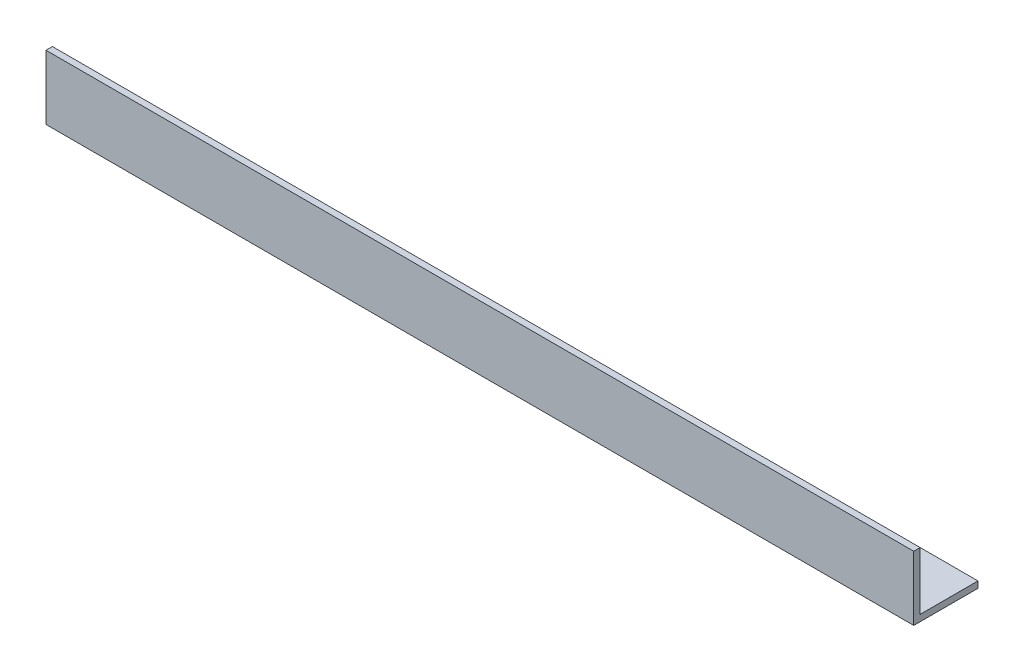
ISO-10303-21;
HEADER;
FILE_DESCRIPTION(('STEP AP214'),'2;1');
FILE_NAME('part.step','',(''),(''),'','','');
FILE_SCHEMA(('AUTOMOTIVE_DESIGN { 1 0 10303 214 1 1 1 1 }'));
ENDSEC;
DATA;
#1=APPLICATION_CONTEXT('core data for automotive mechanical design processes');
#2=APPLICATION_PROTOCOL_DEFINITION('international standard','automotive_design',2000,#1);
#3=PRODUCT_CONTEXT('',#1,'mechanical');
#4=PRODUCT('Part','Part','',(#3));
#5=PRODUCT_RELATED_PRODUCT_CATEGORY('part','',(#4));
#6=PRODUCT_DEFINITION_FORMATION('','',#4);
#7=PRODUCT_DEFINITION_CONTEXT('part definition',#1,'design');
#8=PRODUCT_DEFINITION('design','',#6,#7);
#9=PRODUCT_DEFINITION_SHAPE('','',#8);
#10=(LENGTH_UNIT() NAMED_UNIT(*) SI_UNIT(.MILLI.,.METRE.));
#11=(NAMED_UNIT(*) PLANE_ANGLE_UNIT() SI_UNIT($,.RADIAN.));
#12=(NAMED_UNIT(*) SI_UNIT($,.STERADIAN.) SOLID_ANGLE_UNIT());
#13=UNCERTAINTY_MEASURE_WITH_UNIT(LENGTH_MEASURE(1.E-05),#10,'distance_accuracy_value','');
#14=(GEOMETRIC_REPRESENTATION_CONTEXT(3) GLOBAL_UNCERTAINTY_ASSIGNED_CONTEXT((#13)) GLOBAL_UNIT_ASSIGNED_CONTEXT((#10,
#11,#12)) REPRESENTATION_CONTEXT('',''));
#15=CARTESIAN_POINT('',(0.,0.,0.));
#16=DIRECTION('',(0.,0.,1.));
#17=DIRECTION('',(1.,0.,0.));
#18=AXIS2_PLACEMENT_3D('',#15,#16,#17);
#19=CARTESIAN_POINT('',(270.,20.,0.));
#20=DIRECTION('',(0.,-1.,0.));
#21=DIRECTION('',(0.,0.,-1.));
#22=AXIS2_PLACEMENT_3D('',#19,#20,#21);
#23=PLANE('',#22);
#24=DIRECTION('',(0.,0.,1.));
#25=VECTOR('',#24,1.);
#26=CARTESIAN_POINT('',(0.,20.,0.));
#27=LINE('',#26,#25);
#28=CARTESIAN_POINT('',(0.,20.,-2.));
#29=VERTEX_POINT('',#28);
#30=CARTESIAN_POINT('',(0.,20.,0.));
#31=VERTEX_POINT('',#30);
#32=EDGE_CURVE('E123',#29,#31,#27,.T.);
#33=ORIENTED_EDGE('',*,*,#32,.T.);
#34=DIRECTION('',(-1.,0.,0.));
#35=VECTOR('',#34,1.);
#36=CARTESIAN_POINT('',(270.,20.,0.));
#37=LINE('',#36,#35);
#38=CARTESIAN_POINT('',(270.,20.,0.));
#39=VERTEX_POINT('',#38);
#40=EDGE_CURVE('E11',#39,#31,#37,.T.);
#41=ORIENTED_EDGE('',*,*,#40,.F.);
#42=DIRECTION('',(0.,0.,1.));
#43=VECTOR('',#42,1.);
#44=CARTESIAN_POINT('',(270.,20.,0.));
#45=LINE('',#44,#43);
#46=CARTESIAN_POINT('',(270.,20.,-2.));
#47=VERTEX_POINT('',#46);
#48=EDGE_CURVE('E133',#47,#39,#45,.T.);
#49=ORIENTED_EDGE('',*,*,#48,.F.);
#50=DIRECTION('',(-1.,0.,0.));
#51=VECTOR('',#50,1.);
#52=CARTESIAN_POINT('',(270.,20.,-2.));
#53=LINE('',#52,#51);
#54=EDGE_CURVE('E119',#47,#29,#53,.T.);
#55=ORIENTED_EDGE('',*,*,#54,.T.);
#56=EDGE_LOOP('',(#33,#41,#49,#55));
#57=FACE_BOUND('',#56,.T.);
#58=ADVANCED_FACE('F39',(#57),#23,.F.);
#59=CARTESIAN_POINT('',(270.,20.,0.));
#60=DIRECTION('',(0.,0.,-1.));
#61=DIRECTION('',(-1.,0.,0.));
#62=AXIS2_PLACEMENT_3D('',#59,#60,#61);
#63=PLANE('',#62);
#64=DIRECTION('',(0.,-1.,0.));
#65=VECTOR('',#64,1.);
#66=CARTESIAN_POINT('',(0.,20.,0.));
#67=LINE('',#66,#65);
#68=CARTESIAN_POINT('',(0.,0.,0.));
#69=VERTEX_POINT('',#68);
#70=EDGE_CURVE('E126',#31,#69,#67,.T.);
#71=ORIENTED_EDGE('',*,*,#70,.T.);
#72=DIRECTION('',(-1.,0.,0.));
#73=VECTOR('',#72,1.);
#74=CARTESIAN_POINT('',(270.,0.,0.));
#75=LINE('',#74,#73);
#76=CARTESIAN_POINT('',(270.,0.,0.));
#77=VERTEX_POINT('',#76);
#78=EDGE_CURVE('E47',#77,#69,#75,.T.);
#79=ORIENTED_EDGE('',*,*,#78,.F.);
#80=DIRECTION('',(0.,-1.,0.));
#81=VECTOR('',#80,1.);
#82=CARTESIAN_POINT('',(270.,20.,0.));
#83=LINE('',#82,#81);
#84=EDGE_CURVE('E92',#39,#77,#83,.T.);
#85=ORIENTED_EDGE('',*,*,#84,.F.);
#86=ORIENTED_EDGE('',*,*,#40,.T.);
#87=EDGE_LOOP('',(#71,#79,#85,#86));
#88=FACE_BOUND('',#87,.T.);
#89=ADVANCED_FACE('F157',(#88),#63,.F.);
#90=CARTESIAN_POINT('',(270.,0.,0.));
#91=DIRECTION('',(0.,1.,0.));
#92=DIRECTION('',(0.,0.,1.));
#93=AXIS2_PLACEMENT_3D('',#90,#91,#92);
#94=PLANE('',#93);
#95=DIRECTION('',(0.,0.,-1.));
#96=VECTOR('',#95,1.);
#97=CARTESIAN_POINT('',(0.,0.,0.));
#98=LINE('',#97,#96);
#99=CARTESIAN_POINT('',(0.,0.,-20.));
#100=VERTEX_POINT('',#99);
#101=EDGE_CURVE('E128',#69,#100,#98,.T.);
#102=ORIENTED_EDGE('',*,*,#101,.T.);
#103=DIRECTION('',(-1.,0.,0.));
#104=VECTOR('',#103,1.);
#105=CARTESIAN_POINT('',(270.,0.,-20.));
#106=LINE('',#105,#104);
#107=CARTESIAN_POINT('',(270.,0.,-20.));
#108=VERTEX_POINT('',#107);
#109=EDGE_CURVE('E114',#108,#100,#106,.T.);
#110=ORIENTED_EDGE('',*,*,#109,.F.);
#111=DIRECTION('',(0.,0.,-1.));
#112=VECTOR('',#111,1.);
#113=CARTESIAN_POINT('',(270.,0.,0.));
#114=LINE('',#113,#112);
#115=EDGE_CURVE('E105',#77,#108,#114,.T.);
#116=ORIENTED_EDGE('',*,*,#115,.F.);
#117=ORIENTED_EDGE('',*,*,#78,.T.);
#118=EDGE_LOOP('',(#102,#110,#116,#117));
#119=FACE_BOUND('',#118,.T.);
#120=ADVANCED_FACE('F139',(#119),#94,.F.);
#121=CARTESIAN_POINT('',(270.,0.,-20.));
#122=DIRECTION('',(0.,0.,1.));
#123=DIRECTION('',(1.,0.,0.));
#124=AXIS2_PLACEMENT_3D('',#121,#122,#123);
#125=PLANE('',#124);
#126=DIRECTION('',(0.,1.,0.));
#127=VECTOR('',#126,1.);
#128=CARTESIAN_POINT('',(0.,0.,-20.));
#129=LINE('',#128,#127);
#130=CARTESIAN_POINT('',(0.,2.,-20.));
#131=VERTEX_POINT('',#130);
#132=EDGE_CURVE('E113',#100,#131,#129,.T.);
#133=ORIENTED_EDGE('',*,*,#132,.T.);
#134=DIRECTION('',(-1.,0.,0.));
#135=VECTOR('',#134,1.);
#136=CARTESIAN_POINT('',(270.,2.,-20.));
#137=LINE('',#136,#135);
#138=CARTESIAN_POINT('',(270.,2.,-20.));
#139=VERTEX_POINT('',#138);
#140=EDGE_CURVE('E110',#139,#131,#137,.T.);
#141=ORIENTED_EDGE('',*,*,#140,.F.);
#142=DIRECTION('',(0.,1.,0.));
#143=VECTOR('',#142,1.);
#144=CARTESIAN_POINT('',(270.,0.,-20.));
#145=LINE('',#144,#143);
#146=EDGE_CURVE('E99',#108,#139,#145,.T.);
#147=ORIENTED_EDGE('',*,*,#146,.F.);
#148=ORIENTED_EDGE('',*,*,#109,.T.);
#149=EDGE_LOOP('',(#133,#141,#147,#148));
#150=FACE_BOUND('',#149,.T.);
#151=ADVANCED_FACE('F111',(#150),#125,.F.);
#152=CARTESIAN_POINT('',(270.,2.,-20.));
#153=DIRECTION('',(0.,-1.,0.));
#154=DIRECTION('',(0.,0.,-1.));
#155=AXIS2_PLACEMENT_3D('',#152,#153,#154);
#156=PLANE('',#155);
#157=DIRECTION('',(0.,0.,1.));
#158=VECTOR('',#157,1.);
#159=CARTESIAN_POINT('',(0.,2.,-20.));
#160=LINE('',#159,#158);
#161=CARTESIAN_POINT('',(0.,2.,-2.));
#162=VERTEX_POINT('',#161);
#163=EDGE_CURVE('E78',#131,#162,#160,.T.);
#164=ORIENTED_EDGE('',*,*,#163,.T.);
#165=DIRECTION('',(-1.,0.,0.));
#166=VECTOR('',#165,1.);
#167=CARTESIAN_POINT('',(270.,2.,-2.));
#168=LINE('',#167,#166);
#169=CARTESIAN_POINT('',(270.,2.,-2.));
#170=VERTEX_POINT('',#169);
#171=EDGE_CURVE('E115',#170,#162,#168,.T.);
#172=ORIENTED_EDGE('',*,*,#171,.F.);
#173=DIRECTION('',(0.,0.,1.));
#174=VECTOR('',#173,1.);
#175=CARTESIAN_POINT('',(270.,2.,-20.));
#176=LINE('',#175,#174);
#177=EDGE_CURVE('E103',#139,#170,#176,.T.);
#178=ORIENTED_EDGE('',*,*,#177,.F.);
#179=ORIENTED_EDGE('',*,*,#140,.T.);
#180=EDGE_LOOP('',(#164,#172,#178,#179));
#181=FACE_BOUND('',#180,.T.);
#182=ADVANCED_FACE('F117',(#181),#156,.F.);
#183=CARTESIAN_POINT('',(270.,2.,-2.));
#184=DIRECTION('',(0.,0.,1.));
#185=DIRECTION('',(0.,-1.,0.));
#186=AXIS2_PLACEMENT_3D('',#183,#184,#185);
#187=PLANE('',#186);
#188=DIRECTION('',(0.,1.,0.));
#189=VECTOR('',#188,1.);
#190=CARTESIAN_POINT('',(0.,2.,-2.));
#191=LINE('',#190,#189);
#192=EDGE_CURVE('E84',#162,#29,#191,.T.);
#193=ORIENTED_EDGE('',*,*,#192,.T.);
#194=ORIENTED_EDGE('',*,*,#54,.F.);
#195=DIRECTION('',(0.,1.,0.));
#196=VECTOR('',#195,1.);
#197=CARTESIAN_POINT('',(270.,2.,-2.));
#198=LINE('',#197,#196);
#199=EDGE_CURVE('E55',#170,#47,#198,.T.);
#200=ORIENTED_EDGE('',*,*,#199,.F.);
#201=ORIENTED_EDGE('',*,*,#171,.T.);
#202=EDGE_LOOP('',(#193,#194,#200,#201));
#203=FACE_BOUND('',#202,.T.);
#204=ADVANCED_FACE('F146',(#203),#187,.F.);
#205=CARTESIAN_POINT('',(270.,0.,0.));
#206=DIRECTION('',(1.,0.,0.));
#207=DIRECTION('',(0.,0.,-1.));
#208=AXIS2_PLACEMENT_3D('',#205,#206,#207);
#209=PLANE('',#208);
#210=ORIENTED_EDGE('',*,*,#48,.T.);
#211=ORIENTED_EDGE('',*,*,#84,.T.);
#212=ORIENTED_EDGE('',*,*,#115,.T.);
#213=ORIENTED_EDGE('',*,*,#146,.T.);
#214=ORIENTED_EDGE('',*,*,#177,.T.);
#215=ORIENTED_EDGE('',*,*,#199,.T.);
#216=EDGE_LOOP('',(#210,#211,#212,#213,#214,#215));
#217=FACE_BOUND('',#216,.T.);
#218=ADVANCED_FACE('F101',(#217),#209,.T.);
#219=CARTESIAN_POINT('',(0.,0.,0.));
#220=DIRECTION('',(1.,0.,0.));
#221=DIRECTION('',(0.,0.,-1.));
#222=AXIS2_PLACEMENT_3D('',#219,#220,#221);
#223=PLANE('',#222);
#224=ORIENTED_EDGE('',*,*,#32,.F.);
#225=ORIENTED_EDGE('',*,*,#192,.F.);
#226=ORIENTED_EDGE('',*,*,#163,.F.);
#227=ORIENTED_EDGE('',*,*,#132,.F.);
#228=ORIENTED_EDGE('',*,*,#101,.F.);
#229=ORIENTED_EDGE('',*,*,#70,.F.);
#230=EDGE_LOOP('',(#224,#225,#226,#227,#228,#229));
#231=FACE_BOUND('',#230,.T.);
#232=ADVANCED_FACE('F142',(#231),#223,.F.);
#233=CLOSED_SHELL('',(#58,#89,#120,#151,#182,#204,#218,#232));
#234=MANIFOLD_SOLID_BREP('B2',#233);
#235=ADVANCED_BREP_SHAPE_REPRESENTATION('',(#18,#234),#14);
#236=SHAPE_DEFINITION_REPRESENTATION(#9,#235);
ENDSEC;
END-ISO-10303-21;
